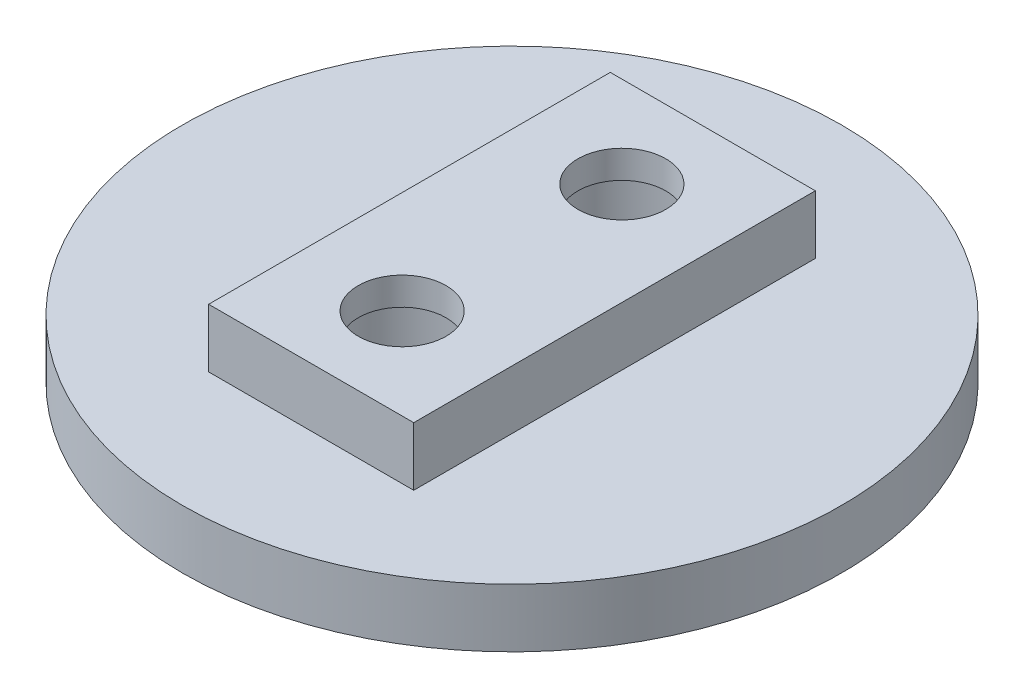
ISO-10303-21;
HEADER;
FILE_DESCRIPTION(('STEP AP214'),'2;1');
FILE_NAME('part.step','',(''),(''),'','','');
FILE_SCHEMA(('AUTOMOTIVE_DESIGN { 1 0 10303 214 1 1 1 1 }'));
ENDSEC;
DATA;
#1=APPLICATION_CONTEXT('core data for automotive mechanical design processes');
#2=APPLICATION_PROTOCOL_DEFINITION('international standard','automotive_design',2000,#1);
#3=PRODUCT_CONTEXT('',#1,'mechanical');
#4=PRODUCT('Part','Part','',(#3));
#5=PRODUCT_RELATED_PRODUCT_CATEGORY('part','',(#4));
#6=PRODUCT_DEFINITION_FORMATION('','',#4);
#7=PRODUCT_DEFINITION_CONTEXT('part definition',#1,'design');
#8=PRODUCT_DEFINITION('design','',#6,#7);
#9=PRODUCT_DEFINITION_SHAPE('','',#8);
#10=(LENGTH_UNIT() NAMED_UNIT(*) SI_UNIT(.MILLI.,.METRE.));
#11=(NAMED_UNIT(*) PLANE_ANGLE_UNIT() SI_UNIT($,.RADIAN.));
#12=(NAMED_UNIT(*) SI_UNIT($,.STERADIAN.) SOLID_ANGLE_UNIT());
#13=UNCERTAINTY_MEASURE_WITH_UNIT(LENGTH_MEASURE(1.E-05),#10,'distance_accuracy_value','');
#14=(GEOMETRIC_REPRESENTATION_CONTEXT(3) GLOBAL_UNCERTAINTY_ASSIGNED_CONTEXT((#13)) GLOBAL_UNIT_ASSIGNED_CONTEXT((#10,
#11,#12)) REPRESENTATION_CONTEXT('',''));
#15=CARTESIAN_POINT('',(0.,0.,0.));
#16=DIRECTION('',(0.,0.,1.));
#17=DIRECTION('',(1.,0.,0.));
#18=AXIS2_PLACEMENT_3D('',#15,#16,#17);
#19=CARTESIAN_POINT('',(0.,0.,0.));
#20=DIRECTION('',(0.,1.,0.));
#21=DIRECTION('',(0.,0.,1.));
#22=AXIS2_PLACEMENT_3D('',#19,#20,#21);
#23=PLANE('',#22);
#24=CARTESIAN_POINT('',(0.,0.,0.));
#25=DIRECTION('',(0.,1.,0.));
#26=DIRECTION('',(0.,0.,1.));
#27=AXIS2_PLACEMENT_3D('',#24,#25,#26);
#28=CIRCLE('',#27,22.5);
#29=CARTESIAN_POINT('',(0.,0.,22.5));
#30=VERTEX_POINT('',#29);
#31=EDGE_CURVE('E49',#30,#30,#28,.T.);
#32=ORIENTED_EDGE('',*,*,#31,.F.);
#33=EDGE_LOOP('',(#32));
#34=FACE_BOUND('',#33,.T.);
#35=CARTESIAN_POINT('',(0.,0.,7.5));
#36=DIRECTION('',(0.,-1.,0.));
#37=DIRECTION('',(0.,0.,-1.));
#38=AXIS2_PLACEMENT_3D('',#35,#36,#37);
#39=CIRCLE('',#38,5.);
#40=CARTESIAN_POINT('',(0.,0.,2.5));
#41=VERTEX_POINT('',#40);
#42=EDGE_CURVE('E132',#41,#41,#39,.T.);
#43=ORIENTED_EDGE('',*,*,#42,.F.);
#44=EDGE_LOOP('',(#43));
#45=FACE_BOUND('',#44,.T.);
#46=CARTESIAN_POINT('',(0.,0.,-7.5));
#47=DIRECTION('',(0.,1.,0.));
#48=DIRECTION('',(0.,0.,1.));
#49=AXIS2_PLACEMENT_3D('',#46,#47,#48);
#50=CIRCLE('',#49,5.);
#51=CARTESIAN_POINT('',(0.,0.,-2.5));
#52=VERTEX_POINT('',#51);
#53=EDGE_CURVE('E126',#52,#52,#50,.T.);
#54=ORIENTED_EDGE('',*,*,#53,.T.);
#55=EDGE_LOOP('',(#54));
#56=FACE_BOUND('',#55,.T.);
#57=ADVANCED_FACE('F39',(#34,#45,#56),#23,.F.);
#58=CARTESIAN_POINT('',(0.,0.,7.5));
#59=DIRECTION('',(0.,1.,0.));
#60=DIRECTION('',(0.,0.,1.));
#61=AXIS2_PLACEMENT_3D('',#58,#59,#60);
#62=CYLINDRICAL_SURFACE('',#61,3.);
#63=CARTESIAN_POINT('',(0.,8.,7.5));
#64=DIRECTION('',(0.,-1.,0.));
#65=DIRECTION('',(0.,0.,-1.));
#66=AXIS2_PLACEMENT_3D('',#63,#64,#65);
#67=CIRCLE('',#66,3.);
#68=CARTESIAN_POINT('',(0.,8.,4.5));
#69=VERTEX_POINT('',#68);
#70=EDGE_CURVE('E124',#69,#69,#67,.T.);
#71=ORIENTED_EDGE('',*,*,#70,.F.);
#72=EDGE_LOOP('',(#71));
#73=FACE_BOUND('',#72,.T.);
#74=CARTESIAN_POINT('',(0.,6.1,7.5));
#75=DIRECTION('',(0.,-1.,0.));
#76=DIRECTION('',(0.,0.,-1.));
#77=AXIS2_PLACEMENT_3D('',#74,#75,#76);
#78=CIRCLE('',#77,3.);
#79=CARTESIAN_POINT('',(0.,6.1,4.5));
#80=VERTEX_POINT('',#79);
#81=EDGE_CURVE('E43',#80,#80,#78,.T.);
#82=ORIENTED_EDGE('',*,*,#81,.T.);
#83=EDGE_LOOP('',(#82));
#84=FACE_BOUND('',#83,.T.);
#85=ADVANCED_FACE('F184',(#73,#84),#62,.F.);
#86=CARTESIAN_POINT('',(0.,8.,0.));
#87=DIRECTION('',(0.,-1.,0.));
#88=DIRECTION('',(0.,0.,-1.));
#89=AXIS2_PLACEMENT_3D('',#86,#87,#88);
#90=PLANE('',#89);
#91=DIRECTION('',(0.,0.,-1.));
#92=VECTOR('',#91,1.);
#93=CARTESIAN_POINT('',(7.,8.,13.71));
#94=LINE('',#93,#92);
#95=CARTESIAN_POINT('',(7.,8.,13.71));
#96=VERTEX_POINT('',#95);
#97=CARTESIAN_POINT('',(7.,8.,-13.71));
#98=VERTEX_POINT('',#97);
#99=EDGE_CURVE('E93',#96,#98,#94,.T.);
#100=ORIENTED_EDGE('',*,*,#99,.T.);
#101=DIRECTION('',(-1.,0.,0.));
#102=VECTOR('',#101,1.);
#103=CARTESIAN_POINT('',(-7.,8.,-13.71));
#104=LINE('',#103,#102);
#105=CARTESIAN_POINT('',(-7.,8.,-13.71));
#106=VERTEX_POINT('',#105);
#107=EDGE_CURVE('E81',#98,#106,#104,.T.);
#108=ORIENTED_EDGE('',*,*,#107,.T.);
#109=DIRECTION('',(0.,0.,1.));
#110=VECTOR('',#109,1.);
#111=CARTESIAN_POINT('',(-7.,8.,13.71));
#112=LINE('',#111,#110);
#113=CARTESIAN_POINT('',(-7.,8.,13.71));
#114=VERTEX_POINT('',#113);
#115=EDGE_CURVE('E92',#106,#114,#112,.T.);
#116=ORIENTED_EDGE('',*,*,#115,.T.);
#117=DIRECTION('',(1.,0.,0.));
#118=VECTOR('',#117,1.);
#119=CARTESIAN_POINT('',(-7.,8.,13.71));
#120=LINE('',#119,#118);
#121=EDGE_CURVE('E99',#114,#96,#120,.T.);
#122=ORIENTED_EDGE('',*,*,#121,.T.);
#123=EDGE_LOOP('',(#100,#108,#116,#122));
#124=FACE_BOUND('',#123,.T.);
#125=ORIENTED_EDGE('',*,*,#70,.T.);
#126=EDGE_LOOP('',(#125));
#127=FACE_BOUND('',#126,.T.);
#128=CARTESIAN_POINT('',(0.,8.,-7.5));
#129=DIRECTION('',(0.,1.,0.));
#130=DIRECTION('',(0.,0.,1.));
#131=AXIS2_PLACEMENT_3D('',#128,#129,#130);
#132=CIRCLE('',#131,3.);
#133=CARTESIAN_POINT('',(0.,8.,-4.5));
#134=VERTEX_POINT('',#133);
#135=EDGE_CURVE('E142',#134,#134,#132,.T.);
#136=ORIENTED_EDGE('',*,*,#135,.F.);
#137=EDGE_LOOP('',(#136));
#138=FACE_BOUND('',#137,.T.);
#139=ADVANCED_FACE('F96',(#124,#127,#138),#90,.F.);
#140=CARTESIAN_POINT('',(0.,4.,0.));
#141=DIRECTION('',(0.,-1.,0.));
#142=DIRECTION('',(0.,0.,-1.));
#143=AXIS2_PLACEMENT_3D('',#140,#141,#142);
#144=CYLINDRICAL_SURFACE('',#143,22.5);
#145=CARTESIAN_POINT('',(0.,4.,0.));
#146=DIRECTION('',(0.,1.,0.));
#147=DIRECTION('',(0.,0.,1.));
#148=AXIS2_PLACEMENT_3D('',#145,#146,#147);
#149=CIRCLE('',#148,22.5);
#150=CARTESIAN_POINT('',(0.,4.,22.5));
#151=VERTEX_POINT('',#150);
#152=EDGE_CURVE('E11',#151,#151,#149,.T.);
#153=ORIENTED_EDGE('',*,*,#152,.F.);
#154=EDGE_LOOP('',(#153));
#155=FACE_BOUND('',#154,.T.);
#156=ORIENTED_EDGE('',*,*,#31,.T.);
#157=EDGE_LOOP('',(#156));
#158=FACE_BOUND('',#157,.T.);
#159=ADVANCED_FACE('F41',(#155,#158),#144,.T.);
#160=CARTESIAN_POINT('',(0.,4.,0.));
#161=DIRECTION('',(0.,1.,0.));
#162=DIRECTION('',(0.,0.,1.));
#163=AXIS2_PLACEMENT_3D('',#160,#161,#162);
#164=PLANE('',#163);
#165=DIRECTION('',(0.,0.,-1.));
#166=VECTOR('',#165,1.);
#167=CARTESIAN_POINT('',(7.,4.,13.71));
#168=LINE('',#167,#166);
#169=CARTESIAN_POINT('',(7.,4.,13.71));
#170=VERTEX_POINT('',#169);
#171=CARTESIAN_POINT('',(7.,4.,-13.71));
#172=VERTEX_POINT('',#171);
#173=EDGE_CURVE('E57',#170,#172,#168,.T.);
#174=ORIENTED_EDGE('',*,*,#173,.F.);
#175=DIRECTION('',(1.,0.,0.));
#176=VECTOR('',#175,1.);
#177=CARTESIAN_POINT('',(-7.,4.,13.71));
#178=LINE('',#177,#176);
#179=CARTESIAN_POINT('',(-7.,4.,13.71));
#180=VERTEX_POINT('',#179);
#181=EDGE_CURVE('E61',#180,#170,#178,.T.);
#182=ORIENTED_EDGE('',*,*,#181,.F.);
#183=DIRECTION('',(0.,0.,1.));
#184=VECTOR('',#183,1.);
#185=CARTESIAN_POINT('',(-7.,4.,13.71));
#186=LINE('',#185,#184);
#187=CARTESIAN_POINT('',(-7.,4.,-13.71));
#188=VERTEX_POINT('',#187);
#189=EDGE_CURVE('E159',#188,#180,#186,.T.);
#190=ORIENTED_EDGE('',*,*,#189,.F.);
#191=DIRECTION('',(-1.,0.,0.));
#192=VECTOR('',#191,1.);
#193=CARTESIAN_POINT('',(-7.,4.,-13.71));
#194=LINE('',#193,#192);
#195=EDGE_CURVE('E156',#172,#188,#194,.T.);
#196=ORIENTED_EDGE('',*,*,#195,.F.);
#197=EDGE_LOOP('',(#174,#182,#190,#196));
#198=FACE_BOUND('',#197,.T.);
#199=ORIENTED_EDGE('',*,*,#152,.T.);
#200=EDGE_LOOP('',(#199));
#201=FACE_BOUND('',#200,.T.);
#202=ADVANCED_FACE('F172',(#198,#201),#164,.T.);
#203=CARTESIAN_POINT('',(7.,8.,13.71));
#204=DIRECTION('',(-1.,0.,0.));
#205=DIRECTION('',(0.,0.,1.));
#206=AXIS2_PLACEMENT_3D('',#203,#204,#205);
#207=PLANE('',#206);
#208=ORIENTED_EDGE('',*,*,#173,.T.);
#209=DIRECTION('',(0.,-1.,0.));
#210=VECTOR('',#209,1.);
#211=CARTESIAN_POINT('',(7.,8.,-13.71));
#212=LINE('',#211,#210);
#213=EDGE_CURVE('E86',#98,#172,#212,.T.);
#214=ORIENTED_EDGE('',*,*,#213,.F.);
#215=ORIENTED_EDGE('',*,*,#99,.F.);
#216=DIRECTION('',(0.,-1.,0.));
#217=VECTOR('',#216,1.);
#218=CARTESIAN_POINT('',(7.,8.,13.71));
#219=LINE('',#218,#217);
#220=EDGE_CURVE('E153',#96,#170,#219,.T.);
#221=ORIENTED_EDGE('',*,*,#220,.T.);
#222=EDGE_LOOP('',(#208,#214,#215,#221));
#223=FACE_BOUND('',#222,.T.);
#224=ADVANCED_FACE('F105',(#223),#207,.F.);
#225=CARTESIAN_POINT('',(-7.,8.,-13.71));
#226=DIRECTION('',(0.,0.,1.));
#227=DIRECTION('',(1.,0.,0.));
#228=AXIS2_PLACEMENT_3D('',#225,#226,#227);
#229=PLANE('',#228);
#230=ORIENTED_EDGE('',*,*,#195,.T.);
#231=DIRECTION('',(0.,-1.,0.));
#232=VECTOR('',#231,1.);
#233=CARTESIAN_POINT('',(-7.,8.,-13.71));
#234=LINE('',#233,#232);
#235=EDGE_CURVE('E88',#106,#188,#234,.T.);
#236=ORIENTED_EDGE('',*,*,#235,.F.);
#237=ORIENTED_EDGE('',*,*,#107,.F.);
#238=ORIENTED_EDGE('',*,*,#213,.T.);
#239=EDGE_LOOP('',(#230,#236,#237,#238));
#240=FACE_BOUND('',#239,.T.);
#241=ADVANCED_FACE('F84',(#240),#229,.F.);
#242=CARTESIAN_POINT('',(-7.,8.,13.71));
#243=DIRECTION('',(1.,0.,0.));
#244=DIRECTION('',(0.,0.,-1.));
#245=AXIS2_PLACEMENT_3D('',#242,#243,#244);
#246=PLANE('',#245);
#247=ORIENTED_EDGE('',*,*,#189,.T.);
#248=DIRECTION('',(0.,-1.,0.));
#249=VECTOR('',#248,1.);
#250=CARTESIAN_POINT('',(-7.,8.,13.71));
#251=LINE('',#250,#249);
#252=EDGE_CURVE('E112',#114,#180,#251,.T.);
#253=ORIENTED_EDGE('',*,*,#252,.F.);
#254=ORIENTED_EDGE('',*,*,#115,.F.);
#255=ORIENTED_EDGE('',*,*,#235,.T.);
#256=EDGE_LOOP('',(#247,#253,#254,#255));
#257=FACE_BOUND('',#256,.T.);
#258=ADVANCED_FACE('F171',(#257),#246,.F.);
#259=CARTESIAN_POINT('',(-7.,8.,13.71));
#260=DIRECTION('',(0.,0.,-1.));
#261=DIRECTION('',(-1.,0.,0.));
#262=AXIS2_PLACEMENT_3D('',#259,#260,#261);
#263=PLANE('',#262);
#264=ORIENTED_EDGE('',*,*,#181,.T.);
#265=ORIENTED_EDGE('',*,*,#220,.F.);
#266=ORIENTED_EDGE('',*,*,#121,.F.);
#267=ORIENTED_EDGE('',*,*,#252,.T.);
#268=EDGE_LOOP('',(#264,#265,#266,#267));
#269=FACE_BOUND('',#268,.T.);
#270=ADVANCED_FACE('F169',(#269),#263,.F.);
#271=CARTESIAN_POINT('',(0.,0.,-7.5));
#272=DIRECTION('',(0.,1.,0.));
#273=DIRECTION('',(0.,0.,1.));
#274=AXIS2_PLACEMENT_3D('',#271,#272,#273);
#275=CYLINDRICAL_SURFACE('',#274,3.);
#276=CARTESIAN_POINT('',(0.,6.1,-7.5));
#277=DIRECTION('',(0.,1.,0.));
#278=DIRECTION('',(0.,0.,1.));
#279=AXIS2_PLACEMENT_3D('',#276,#277,#278);
#280=CIRCLE('',#279,3.);
#281=CARTESIAN_POINT('',(0.,6.1,-4.5));
#282=VERTEX_POINT('',#281);
#283=EDGE_CURVE('E115',#282,#282,#280,.F.);
#284=ORIENTED_EDGE('',*,*,#283,.T.);
#285=EDGE_LOOP('',(#284));
#286=FACE_BOUND('',#285,.T.);
#287=ORIENTED_EDGE('',*,*,#135,.T.);
#288=EDGE_LOOP('',(#287));
#289=FACE_BOUND('',#288,.T.);
#290=ADVANCED_FACE('F201',(#286,#289),#275,.F.);
#291=CARTESIAN_POINT('',(0.,6.1,-7.5));
#292=DIRECTION('',(0.,1.,0.));
#293=DIRECTION('',(0.,0.,1.));
#294=AXIS2_PLACEMENT_3D('',#291,#292,#293);
#295=PLANE('',#294);
#296=CARTESIAN_POINT('',(0.,6.1,-7.5));
#297=DIRECTION('',(0.,1.,0.));
#298=DIRECTION('',(0.,0.,1.));
#299=AXIS2_PLACEMENT_3D('',#296,#297,#298);
#300=CIRCLE('',#299,5.);
#301=CARTESIAN_POINT('',(0.,6.1,-2.5));
#302=VERTEX_POINT('',#301);
#303=EDGE_CURVE('E118',#302,#302,#300,.T.);
#304=ORIENTED_EDGE('',*,*,#303,.F.);
#305=EDGE_LOOP('',(#304));
#306=FACE_BOUND('',#305,.T.);
#307=ORIENTED_EDGE('',*,*,#283,.F.);
#308=EDGE_LOOP('',(#307));
#309=FACE_BOUND('',#308,.T.);
#310=ADVANCED_FACE('F192',(#306,#309),#295,.F.);
#311=CARTESIAN_POINT('',(0.,6.1,-7.5));
#312=DIRECTION('',(0.,-1.,0.));
#313=DIRECTION('',(0.,0.,-1.));
#314=AXIS2_PLACEMENT_3D('',#311,#312,#313);
#315=CYLINDRICAL_SURFACE('',#314,5.);
#316=ORIENTED_EDGE('',*,*,#303,.T.);
#317=EDGE_LOOP('',(#316));
#318=FACE_BOUND('',#317,.T.);
#319=ORIENTED_EDGE('',*,*,#53,.F.);
#320=EDGE_LOOP('',(#319));
#321=FACE_BOUND('',#320,.T.);
#322=ADVANCED_FACE('F189',(#318,#321),#315,.F.);
#323=CARTESIAN_POINT('',(0.,6.1,7.5));
#324=DIRECTION('',(0.,-1.,0.));
#325=DIRECTION('',(0.,0.,-1.));
#326=AXIS2_PLACEMENT_3D('',#323,#324,#325);
#327=CYLINDRICAL_SURFACE('',#326,5.);
#328=CARTESIAN_POINT('',(0.,6.1,7.5));
#329=DIRECTION('',(0.,-1.,0.));
#330=DIRECTION('',(0.,0.,-1.));
#331=AXIS2_PLACEMENT_3D('',#328,#329,#330);
#332=CIRCLE('',#331,5.);
#333=CARTESIAN_POINT('',(0.,6.1,2.5));
#334=VERTEX_POINT('',#333);
#335=EDGE_CURVE('E138',#334,#334,#332,.T.);
#336=ORIENTED_EDGE('',*,*,#335,.F.);
#337=EDGE_LOOP('',(#336));
#338=FACE_BOUND('',#337,.T.);
#339=ORIENTED_EDGE('',*,*,#42,.T.);
#340=EDGE_LOOP('',(#339));
#341=FACE_BOUND('',#340,.T.);
#342=ADVANCED_FACE('F191',(#338,#341),#327,.F.);
#343=CARTESIAN_POINT('',(0.,6.1,7.5));
#344=DIRECTION('',(0.,-1.,0.));
#345=DIRECTION('',(0.,0.,-1.));
#346=AXIS2_PLACEMENT_3D('',#343,#344,#345);
#347=PLANE('',#346);
#348=ORIENTED_EDGE('',*,*,#81,.F.);
#349=EDGE_LOOP('',(#348));
#350=FACE_BOUND('',#349,.T.);
#351=ORIENTED_EDGE('',*,*,#335,.T.);
#352=EDGE_LOOP('',(#351));
#353=FACE_BOUND('',#352,.T.);
#354=ADVANCED_FACE('F198',(#350,#353),#347,.T.);
#355=CLOSED_SHELL('',(#57,#85,#139,#159,#202,#224,#241,#258,#270,#290,#310,#322,#342,#354));
#356=MANIFOLD_SOLID_BREP('B2',#355);
#357=ADVANCED_BREP_SHAPE_REPRESENTATION('',(#18,#356),#14);
#358=SHAPE_DEFINITION_REPRESENTATION(#9,#357);
ENDSEC;
END-ISO-10303-21;
